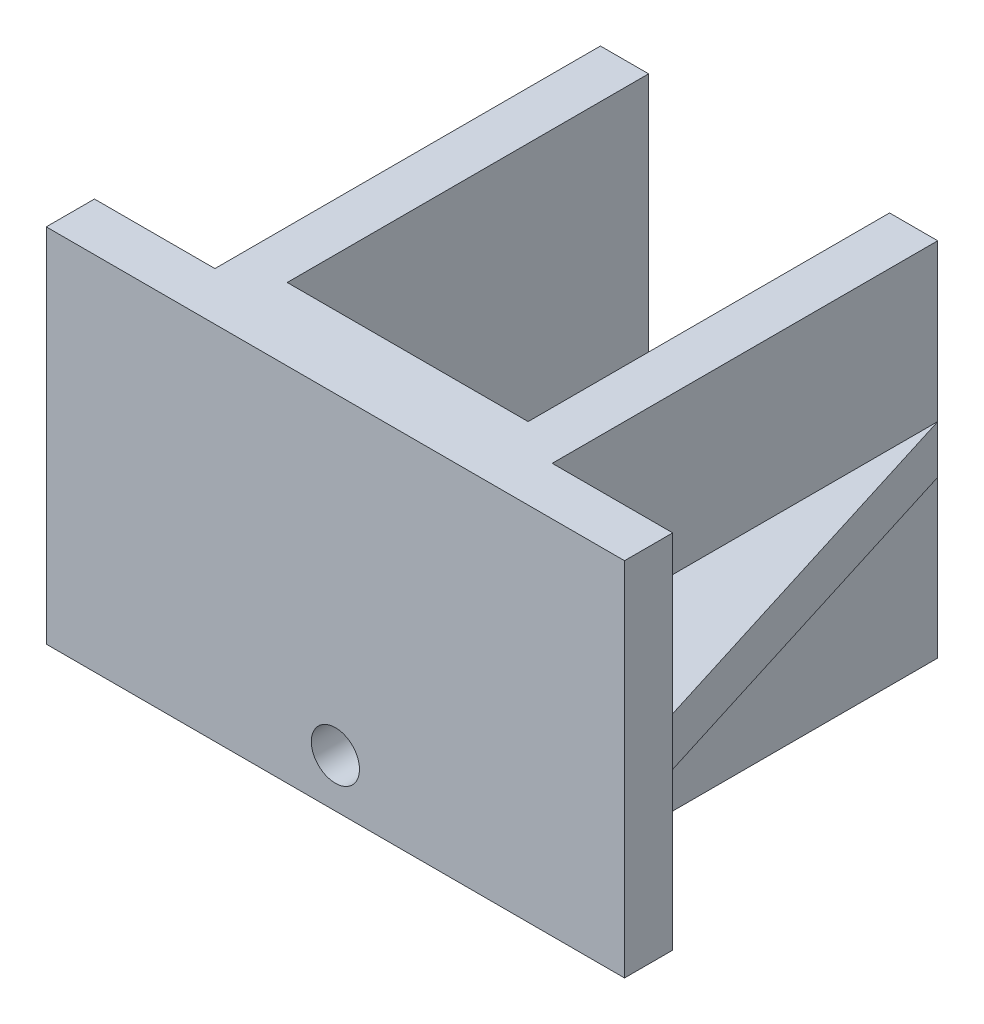
ISO-10303-21;
HEADER;
FILE_DESCRIPTION(('STEP AP214'),'2;1');
FILE_NAME('part.step','',(''),(''),'','','');
FILE_SCHEMA(('AUTOMOTIVE_DESIGN { 1 0 10303 214 1 1 1 1 }'));
ENDSEC;
DATA;
#1=APPLICATION_CONTEXT('core data for automotive mechanical design processes');
#2=APPLICATION_PROTOCOL_DEFINITION('international standard','automotive_design',2000,#1);
#3=PRODUCT_CONTEXT('',#1,'mechanical');
#4=PRODUCT('Part','Part','',(#3));
#5=PRODUCT_RELATED_PRODUCT_CATEGORY('part','',(#4));
#6=PRODUCT_DEFINITION_FORMATION('','',#4);
#7=PRODUCT_DEFINITION_CONTEXT('part definition',#1,'design');
#8=PRODUCT_DEFINITION('design','',#6,#7);
#9=PRODUCT_DEFINITION_SHAPE('','',#8);
#10=(LENGTH_UNIT() NAMED_UNIT(*) SI_UNIT(.MILLI.,.METRE.));
#11=(NAMED_UNIT(*) PLANE_ANGLE_UNIT() SI_UNIT($,.RADIAN.));
#12=(NAMED_UNIT(*) SI_UNIT($,.STERADIAN.) SOLID_ANGLE_UNIT());
#13=UNCERTAINTY_MEASURE_WITH_UNIT(LENGTH_MEASURE(1.E-05),#10,'distance_accuracy_value','');
#14=(GEOMETRIC_REPRESENTATION_CONTEXT(3) GLOBAL_UNCERTAINTY_ASSIGNED_CONTEXT((#13)) GLOBAL_UNIT_ASSIGNED_CONTEXT((#10,
#11,#12)) REPRESENTATION_CONTEXT('',''));
#15=CARTESIAN_POINT('',(0.,0.,0.));
#16=DIRECTION('',(0.,0.,1.));
#17=DIRECTION('',(1.,0.,0.));
#18=AXIS2_PLACEMENT_3D('',#15,#16,#17);
#19=CARTESIAN_POINT('',(-14.,15.,2.));
#20=DIRECTION('',(1.,0.,0.));
#21=DIRECTION('',(0.,0.,-1.));
#22=AXIS2_PLACEMENT_3D('',#19,#20,#21);
#23=PLANE('',#22);
#24=DIRECTION('',(0.,0.,1.));
#25=VECTOR('',#24,1.);
#26=CARTESIAN_POINT('',(-14.,2.,-30.));
#27=LINE('',#26,#25);
#28=CARTESIAN_POINT('',(-14.,2.,-30.));
#29=VERTEX_POINT('',#28);
#30=CARTESIAN_POINT('',(-14.,2.,2.));
#31=VERTEX_POINT('',#30);
#32=EDGE_CURVE('E182',#29,#31,#27,.T.);
#33=ORIENTED_EDGE('',*,*,#32,.T.);
#34=DIRECTION('',(0.,-1.,0.));
#35=VECTOR('',#34,1.);
#36=CARTESIAN_POINT('',(-14.,15.,2.));
#37=LINE('',#36,#35);
#38=CARTESIAN_POINT('',(-14.,15.,2.));
#39=VERTEX_POINT('',#38);
#40=EDGE_CURVE('E195',#39,#31,#37,.T.);
#41=ORIENTED_EDGE('',*,*,#40,.F.);
#42=DIRECTION('',(0.,0.,1.));
#43=VECTOR('',#42,1.);
#44=CARTESIAN_POINT('',(-14.,15.,2.));
#45=LINE('',#44,#43);
#46=CARTESIAN_POINT('',(-14.,15.,-30.));
#47=VERTEX_POINT('',#46);
#48=EDGE_CURVE('E359',#47,#39,#45,.T.);
#49=ORIENTED_EDGE('',*,*,#48,.F.);
#50=DIRECTION('',(0.,-1.,0.));
#51=VECTOR('',#50,1.);
#52=CARTESIAN_POINT('',(-14.,15.,-30.));
#53=LINE('',#52,#51);
#54=EDGE_CURVE('E11',#47,#29,#53,.T.);
#55=ORIENTED_EDGE('',*,*,#54,.T.);
#56=EDGE_LOOP('',(#33,#41,#49,#55));
#57=FACE_BOUND('',#56,.T.);
#58=ADVANCED_FACE('F38',(#57),#23,.F.);
#59=CARTESIAN_POINT('',(-24.,15.,2.));
#60=DIRECTION('',(0.,0.,1.));
#61=DIRECTION('',(1.,0.,0.));
#62=AXIS2_PLACEMENT_3D('',#59,#60,#61);
#63=PLANE('',#62);
#64=DIRECTION('',(-1.,0.,0.));
#65=VECTOR('',#64,1.);
#66=CARTESIAN_POINT('',(-14.,2.,2.));
#67=LINE('',#66,#65);
#68=CARTESIAN_POINT('',(-24.,2.,1.99999999999999));
#69=VERTEX_POINT('',#68);
#70=EDGE_CURVE('E180',#31,#69,#67,.T.);
#71=ORIENTED_EDGE('',*,*,#70,.T.);
#72=DIRECTION('',(0.,-1.,0.));
#73=VECTOR('',#72,1.);
#74=CARTESIAN_POINT('',(-24.,15.,2.));
#75=LINE('',#74,#73);
#76=CARTESIAN_POINT('',(-24.,15.,2.));
#77=VERTEX_POINT('',#76);
#78=EDGE_CURVE('E192',#77,#69,#75,.T.);
#79=ORIENTED_EDGE('',*,*,#78,.F.);
#80=DIRECTION('',(-1.,0.,0.));
#81=VECTOR('',#80,1.);
#82=CARTESIAN_POINT('',(-24.,15.,2.));
#83=LINE('',#82,#81);
#84=EDGE_CURVE('E356',#39,#77,#83,.T.);
#85=ORIENTED_EDGE('',*,*,#84,.F.);
#86=ORIENTED_EDGE('',*,*,#40,.T.);
#87=EDGE_LOOP('',(#71,#79,#85,#86));
#88=FACE_BOUND('',#87,.T.);
#89=ADVANCED_FACE('F190',(#88),#63,.F.);
#90=CARTESIAN_POINT('',(24.,15.,1.99999999999999));
#91=DIRECTION('',(0.,0.,1.));
#92=DIRECTION('',(1.,0.,0.));
#93=AXIS2_PLACEMENT_3D('',#90,#91,#92);
#94=PLANE('',#93);
#95=DIRECTION('',(1.,0.,0.));
#96=VECTOR('',#95,1.);
#97=CARTESIAN_POINT('',(14.,2.,2.));
#98=LINE('',#97,#96);
#99=CARTESIAN_POINT('',(14.,2.,2.));
#100=VERTEX_POINT('',#99);
#101=CARTESIAN_POINT('',(24.,2.,1.99999999999999));
#102=VERTEX_POINT('',#101);
#103=EDGE_CURVE('E370',#100,#102,#98,.T.);
#104=ORIENTED_EDGE('',*,*,#103,.F.);
#105=DIRECTION('',(0.,-1.,0.));
#106=VECTOR('',#105,1.);
#107=CARTESIAN_POINT('',(14.,15.,2.));
#108=LINE('',#107,#106);
#109=CARTESIAN_POINT('',(14.,15.,2.));
#110=VERTEX_POINT('',#109);
#111=EDGE_CURVE('E301',#110,#100,#108,.T.);
#112=ORIENTED_EDGE('',*,*,#111,.F.);
#113=DIRECTION('',(-1.,0.,0.));
#114=VECTOR('',#113,1.);
#115=CARTESIAN_POINT('',(24.,15.,1.99999999999999));
#116=LINE('',#115,#114);
#117=CARTESIAN_POINT('',(24.,15.,1.99999999999999));
#118=VERTEX_POINT('',#117);
#119=EDGE_CURVE('E346',#118,#110,#116,.T.);
#120=ORIENTED_EDGE('',*,*,#119,.F.);
#121=DIRECTION('',(0.,-1.,0.));
#122=VECTOR('',#121,1.);
#123=CARTESIAN_POINT('',(24.,15.,1.99999999999999));
#124=LINE('',#123,#122);
#125=EDGE_CURVE('E306',#118,#102,#124,.T.);
#126=ORIENTED_EDGE('',*,*,#125,.T.);
#127=EDGE_LOOP('',(#104,#112,#120,#126));
#128=FACE_BOUND('',#127,.T.);
#129=ADVANCED_FACE('F443',(#128),#94,.F.);
#130=CARTESIAN_POINT('',(14.,15.,2.));
#131=DIRECTION('',(-1.,0.,0.));
#132=DIRECTION('',(0.,0.,1.));
#133=AXIS2_PLACEMENT_3D('',#130,#131,#132);
#134=PLANE('',#133);
#135=DIRECTION('',(0.,0.,1.));
#136=VECTOR('',#135,1.);
#137=CARTESIAN_POINT('',(14.,2.,-30.));
#138=LINE('',#137,#136);
#139=CARTESIAN_POINT('',(14.,2.,-30.));
#140=VERTEX_POINT('',#139);
#141=EDGE_CURVE('E383',#140,#100,#138,.T.);
#142=ORIENTED_EDGE('',*,*,#141,.F.);
#143=DIRECTION('',(0.,-1.,0.));
#144=VECTOR('',#143,1.);
#145=CARTESIAN_POINT('',(14.,15.,-30.));
#146=LINE('',#145,#144);
#147=CARTESIAN_POINT('',(14.,15.,-30.));
#148=VERTEX_POINT('',#147);
#149=EDGE_CURVE('E296',#148,#140,#146,.T.);
#150=ORIENTED_EDGE('',*,*,#149,.F.);
#151=DIRECTION('',(0.,0.,-1.));
#152=VECTOR('',#151,1.);
#153=CARTESIAN_POINT('',(14.,15.,2.));
#154=LINE('',#153,#152);
#155=EDGE_CURVE('E343',#110,#148,#154,.T.);
#156=ORIENTED_EDGE('',*,*,#155,.F.);
#157=ORIENTED_EDGE('',*,*,#111,.T.);
#158=EDGE_LOOP('',(#142,#150,#156,#157));
#159=FACE_BOUND('',#158,.T.);
#160=ADVANCED_FACE('F449',(#159),#134,.F.);
#161=CARTESIAN_POINT('',(-10.,15.,-30.));
#162=DIRECTION('',(0.,0.,1.));
#163=DIRECTION('',(1.,0.,0.));
#164=AXIS2_PLACEMENT_3D('',#161,#162,#163);
#165=PLANE('',#164);
#166=DIRECTION('',(-1.,0.,0.));
#167=VECTOR('',#166,1.);
#168=CARTESIAN_POINT('',(-10.,-15.,-30.));
#169=LINE('',#168,#167);
#170=CARTESIAN_POINT('',(-10.,-15.,-30.));
#171=VERTEX_POINT('',#170);
#172=CARTESIAN_POINT('',(-14.,-15.,-30.));
#173=VERTEX_POINT('',#172);
#174=EDGE_CURVE('E227',#171,#173,#169,.T.);
#175=ORIENTED_EDGE('',*,*,#174,.T.);
#176=CARTESIAN_POINT('',(-14.,-2.,-30.));
#177=VERTEX_POINT('',#176);
#178=EDGE_CURVE('E47',#177,#173,#53,.T.);
#179=ORIENTED_EDGE('',*,*,#178,.F.);
#180=DIRECTION('',(0.,-1.,0.));
#181=VECTOR('',#180,1.);
#182=CARTESIAN_POINT('',(-14.,2.,-30.));
#183=LINE('',#182,#181);
#184=EDGE_CURVE('E175',#29,#177,#183,.T.);
#185=ORIENTED_EDGE('',*,*,#184,.F.);
#186=ORIENTED_EDGE('',*,*,#54,.F.);
#187=DIRECTION('',(-1.,0.,0.));
#188=VECTOR('',#187,1.);
#189=CARTESIAN_POINT('',(-10.,15.,-30.));
#190=LINE('',#189,#188);
#191=CARTESIAN_POINT('',(-10.,15.,-30.));
#192=VERTEX_POINT('',#191);
#193=EDGE_CURVE('E280',#192,#47,#190,.T.);
#194=ORIENTED_EDGE('',*,*,#193,.F.);
#195=DIRECTION('',(0.,-1.,0.));
#196=VECTOR('',#195,1.);
#197=CARTESIAN_POINT('',(-10.,15.,-30.));
#198=LINE('',#197,#196);
#199=EDGE_CURVE('E236',#192,#171,#198,.T.);
#200=ORIENTED_EDGE('',*,*,#199,.T.);
#201=EDGE_LOOP('',(#175,#179,#185,#186,#194,#200));
#202=FACE_BOUND('',#201,.T.);
#203=ADVANCED_FACE('F40',(#202),#165,.F.);
#204=CARTESIAN_POINT('',(-14.,-2.,2.));
#205=VERTEX_POINT('',#204);
#206=CARTESIAN_POINT('',(-14.,-15.,2.));
#207=VERTEX_POINT('',#206);
#208=EDGE_CURVE('E202',#205,#207,#37,.T.);
#209=ORIENTED_EDGE('',*,*,#208,.F.);
#210=DIRECTION('',(0.,0.,1.));
#211=VECTOR('',#210,1.);
#212=CARTESIAN_POINT('',(-14.,-2.,-30.));
#213=LINE('',#212,#211);
#214=EDGE_CURVE('E185',#177,#205,#213,.T.);
#215=ORIENTED_EDGE('',*,*,#214,.F.);
#216=ORIENTED_EDGE('',*,*,#178,.T.);
#217=DIRECTION('',(0.,0.,1.));
#218=VECTOR('',#217,1.);
#219=CARTESIAN_POINT('',(-14.,-15.,2.));
#220=LINE('',#219,#218);
#221=EDGE_CURVE('E219',#173,#207,#220,.T.);
#222=ORIENTED_EDGE('',*,*,#221,.T.);
#223=EDGE_LOOP('',(#209,#215,#216,#222));
#224=FACE_BOUND('',#223,.T.);
#225=ADVANCED_FACE('F218',(#224),#23,.F.);
#226=CARTESIAN_POINT('',(-24.,-2.,2.));
#227=VERTEX_POINT('',#226);
#228=CARTESIAN_POINT('',(-24.,-15.,2.));
#229=VERTEX_POINT('',#228);
#230=EDGE_CURVE('E203',#227,#229,#75,.T.);
#231=ORIENTED_EDGE('',*,*,#230,.F.);
#232=DIRECTION('',(-1.,0.,0.));
#233=VECTOR('',#232,1.);
#234=CARTESIAN_POINT('',(-14.,-2.,2.));
#235=LINE('',#234,#233);
#236=EDGE_CURVE('E54',#205,#227,#235,.T.);
#237=ORIENTED_EDGE('',*,*,#236,.F.);
#238=ORIENTED_EDGE('',*,*,#208,.T.);
#239=DIRECTION('',(-1.,0.,0.));
#240=VECTOR('',#239,1.);
#241=CARTESIAN_POINT('',(-24.,-15.,2.));
#242=LINE('',#241,#240);
#243=EDGE_CURVE('E230',#207,#229,#242,.T.);
#244=ORIENTED_EDGE('',*,*,#243,.T.);
#245=EDGE_LOOP('',(#231,#237,#238,#244));
#246=FACE_BOUND('',#245,.T.);
#247=ADVANCED_FACE('F459',(#246),#63,.F.);
#248=CARTESIAN_POINT('',(-24.,15.,6.));
#249=DIRECTION('',(1.,0.,0.));
#250=DIRECTION('',(0.,0.,-1.));
#251=AXIS2_PLACEMENT_3D('',#248,#249,#250);
#252=PLANE('',#251);
#253=DIRECTION('',(0.,0.,1.));
#254=VECTOR('',#253,1.);
#255=CARTESIAN_POINT('',(-24.,-15.,6.));
#256=LINE('',#255,#254);
#257=CARTESIAN_POINT('',(-24.,-15.,6.));
#258=VERTEX_POINT('',#257);
#259=EDGE_CURVE('E250',#229,#258,#256,.T.);
#260=ORIENTED_EDGE('',*,*,#259,.T.);
#261=DIRECTION('',(0.,-1.,0.));
#262=VECTOR('',#261,1.);
#263=CARTESIAN_POINT('',(-24.,15.,6.));
#264=LINE('',#263,#262);
#265=CARTESIAN_POINT('',(-24.,15.,6.));
#266=VERTEX_POINT('',#265);
#267=EDGE_CURVE('E207',#266,#258,#264,.T.);
#268=ORIENTED_EDGE('',*,*,#267,.F.);
#269=DIRECTION('',(0.,0.,1.));
#270=VECTOR('',#269,1.);
#271=CARTESIAN_POINT('',(-24.,15.,6.));
#272=LINE('',#271,#270);
#273=EDGE_CURVE('E200',#77,#266,#272,.T.);
#274=ORIENTED_EDGE('',*,*,#273,.F.);
#275=ORIENTED_EDGE('',*,*,#78,.T.);
#276=DIRECTION('',(0.,-1.,0.));
#277=VECTOR('',#276,1.);
#278=CARTESIAN_POINT('',(-24.,2.,1.99999999999999));
#279=LINE('',#278,#277);
#280=EDGE_CURVE('E165',#69,#227,#279,.T.);
#281=ORIENTED_EDGE('',*,*,#280,.T.);
#282=ORIENTED_EDGE('',*,*,#230,.T.);
#283=EDGE_LOOP('',(#260,#268,#274,#275,#281,#282));
#284=FACE_BOUND('',#283,.T.);
#285=ADVANCED_FACE('F198',(#284),#252,.F.);
#286=CARTESIAN_POINT('',(-24.,15.,6.));
#287=DIRECTION('',(0.,0.,-1.));
#288=DIRECTION('',(-1.,0.,0.));
#289=AXIS2_PLACEMENT_3D('',#286,#287,#288);
#290=PLANE('',#289);
#291=CARTESIAN_POINT('',(0.,-11.,6.));
#292=DIRECTION('',(0.,0.,-1.));
#293=DIRECTION('',(-1.,0.,0.));
#294=AXIS2_PLACEMENT_3D('',#291,#292,#293);
#295=CIRCLE('',#294,2.);
#296=CARTESIAN_POINT('',(-2.,-11.,6.));
#297=VERTEX_POINT('',#296);
#298=EDGE_CURVE('E396',#297,#297,#295,.T.);
#299=ORIENTED_EDGE('',*,*,#298,.T.);
#300=EDGE_LOOP('',(#299));
#301=FACE_BOUND('',#300,.T.);
#302=DIRECTION('',(1.,0.,0.));
#303=VECTOR('',#302,1.);
#304=CARTESIAN_POINT('',(-24.,-15.,6.));
#305=LINE('',#304,#303);
#306=CARTESIAN_POINT('',(24.,-15.,5.99999999999999));
#307=VERTEX_POINT('',#306);
#308=EDGE_CURVE('E253',#258,#307,#305,.T.);
#309=ORIENTED_EDGE('',*,*,#308,.T.);
#310=DIRECTION('',(0.,-1.,0.));
#311=VECTOR('',#310,1.);
#312=CARTESIAN_POINT('',(24.,15.,5.99999999999999));
#313=LINE('',#312,#311);
#314=CARTESIAN_POINT('',(24.,15.,5.99999999999999));
#315=VERTEX_POINT('',#314);
#316=EDGE_CURVE('E309',#315,#307,#313,.T.);
#317=ORIENTED_EDGE('',*,*,#316,.F.);
#318=DIRECTION('',(1.,0.,0.));
#319=VECTOR('',#318,1.);
#320=CARTESIAN_POINT('',(-24.,15.,6.));
#321=LINE('',#320,#319);
#322=EDGE_CURVE('E322',#266,#315,#321,.T.);
#323=ORIENTED_EDGE('',*,*,#322,.F.);
#324=ORIENTED_EDGE('',*,*,#267,.T.);
#325=EDGE_LOOP('',(#309,#317,#323,#324));
#326=FACE_BOUND('',#325,.T.);
#327=ADVANCED_FACE('F321',(#301,#326),#290,.F.);
#328=CARTESIAN_POINT('',(24.,15.,5.99999999999999));
#329=DIRECTION('',(-1.,0.,0.));
#330=DIRECTION('',(0.,0.,1.));
#331=AXIS2_PLACEMENT_3D('',#328,#329,#330);
#332=PLANE('',#331);
#333=DIRECTION('',(0.,0.,-1.));
#334=VECTOR('',#333,1.);
#335=CARTESIAN_POINT('',(24.,-15.,5.99999999999999));
#336=LINE('',#335,#334);
#337=CARTESIAN_POINT('',(24.,-15.,1.99999999999999));
#338=VERTEX_POINT('',#337);
#339=EDGE_CURVE('E256',#307,#338,#336,.T.);
#340=ORIENTED_EDGE('',*,*,#339,.T.);
#341=CARTESIAN_POINT('',(24.,-2.,1.99999999999999));
#342=VERTEX_POINT('',#341);
#343=EDGE_CURVE('E305',#342,#338,#124,.T.);
#344=ORIENTED_EDGE('',*,*,#343,.F.);
#345=DIRECTION('',(0.,-1.,0.));
#346=VECTOR('',#345,1.);
#347=CARTESIAN_POINT('',(24.,2.,1.99999999999999));
#348=LINE('',#347,#346);
#349=EDGE_CURVE('E242',#102,#342,#348,.T.);
#350=ORIENTED_EDGE('',*,*,#349,.F.);
#351=ORIENTED_EDGE('',*,*,#125,.F.);
#352=DIRECTION('',(0.,0.,-1.));
#353=VECTOR('',#352,1.);
#354=CARTESIAN_POINT('',(24.,15.,5.99999999999999));
#355=LINE('',#354,#353);
#356=EDGE_CURVE('E349',#315,#118,#355,.T.);
#357=ORIENTED_EDGE('',*,*,#356,.F.);
#358=ORIENTED_EDGE('',*,*,#316,.T.);
#359=EDGE_LOOP('',(#340,#344,#350,#351,#357,#358));
#360=FACE_BOUND('',#359,.T.);
#361=ADVANCED_FACE('F326',(#360),#332,.F.);
#362=CARTESIAN_POINT('',(14.,-2.,2.));
#363=VERTEX_POINT('',#362);
#364=CARTESIAN_POINT('',(14.,-15.,2.));
#365=VERTEX_POINT('',#364);
#366=EDGE_CURVE('E300',#363,#365,#108,.T.);
#367=ORIENTED_EDGE('',*,*,#366,.F.);
#368=DIRECTION('',(1.,0.,0.));
#369=VECTOR('',#368,1.);
#370=CARTESIAN_POINT('',(14.,-2.,2.));
#371=LINE('',#370,#369);
#372=EDGE_CURVE('E371',#363,#342,#371,.T.);
#373=ORIENTED_EDGE('',*,*,#372,.T.);
#374=ORIENTED_EDGE('',*,*,#343,.T.);
#375=DIRECTION('',(-1.,0.,0.));
#376=VECTOR('',#375,1.);
#377=CARTESIAN_POINT('',(24.,-15.,1.99999999999999));
#378=LINE('',#377,#376);
#379=EDGE_CURVE('E260',#338,#365,#378,.T.);
#380=ORIENTED_EDGE('',*,*,#379,.T.);
#381=EDGE_LOOP('',(#367,#373,#374,#380));
#382=FACE_BOUND('',#381,.T.);
#383=ADVANCED_FACE('F440',(#382),#94,.F.);
#384=CARTESIAN_POINT('',(14.,-2.,-30.));
#385=VERTEX_POINT('',#384);
#386=CARTESIAN_POINT('',(14.,-15.,-30.));
#387=VERTEX_POINT('',#386);
#388=EDGE_CURVE('E295',#385,#387,#146,.T.);
#389=ORIENTED_EDGE('',*,*,#388,.F.);
#390=DIRECTION('',(0.,0.,1.));
#391=VECTOR('',#390,1.);
#392=CARTESIAN_POINT('',(14.,-2.,-30.));
#393=LINE('',#392,#391);
#394=EDGE_CURVE('E375',#385,#363,#393,.T.);
#395=ORIENTED_EDGE('',*,*,#394,.T.);
#396=ORIENTED_EDGE('',*,*,#366,.T.);
#397=DIRECTION('',(0.,0.,-1.));
#398=VECTOR('',#397,1.);
#399=CARTESIAN_POINT('',(14.,-15.,2.));
#400=LINE('',#399,#398);
#401=EDGE_CURVE('E264',#365,#387,#400,.T.);
#402=ORIENTED_EDGE('',*,*,#401,.T.);
#403=EDGE_LOOP('',(#389,#395,#396,#402));
#404=FACE_BOUND('',#403,.T.);
#405=ADVANCED_FACE('F438',(#404),#134,.F.);
#406=CARTESIAN_POINT('',(9.99999999999999,15.,-30.));
#407=DIRECTION('',(0.,0.,1.));
#408=DIRECTION('',(1.,0.,0.));
#409=AXIS2_PLACEMENT_3D('',#406,#407,#408);
#410=PLANE('',#409);
#411=DIRECTION('',(-1.,0.,0.));
#412=VECTOR('',#411,1.);
#413=CARTESIAN_POINT('',(9.99999999999999,-15.,-30.));
#414=LINE('',#413,#412);
#415=CARTESIAN_POINT('',(9.99999999999999,-15.,-30.));
#416=VERTEX_POINT('',#415);
#417=EDGE_CURVE('E268',#387,#416,#414,.T.);
#418=ORIENTED_EDGE('',*,*,#417,.T.);
#419=DIRECTION('',(0.,-1.,0.));
#420=VECTOR('',#419,1.);
#421=CARTESIAN_POINT('',(9.99999999999999,15.,-30.));
#422=LINE('',#421,#420);
#423=CARTESIAN_POINT('',(9.99999999999999,15.,-30.));
#424=VERTEX_POINT('',#423);
#425=EDGE_CURVE('E291',#424,#416,#422,.T.);
#426=ORIENTED_EDGE('',*,*,#425,.F.);
#427=DIRECTION('',(-1.,0.,0.));
#428=VECTOR('',#427,1.);
#429=CARTESIAN_POINT('',(9.99999999999999,15.,-30.));
#430=LINE('',#429,#428);
#431=EDGE_CURVE('E340',#148,#424,#430,.T.);
#432=ORIENTED_EDGE('',*,*,#431,.F.);
#433=ORIENTED_EDGE('',*,*,#149,.T.);
#434=DIRECTION('',(0.,-1.,0.));
#435=VECTOR('',#434,1.);
#436=CARTESIAN_POINT('',(14.,2.,-30.));
#437=LINE('',#436,#435);
#438=EDGE_CURVE('E238',#140,#385,#437,.T.);
#439=ORIENTED_EDGE('',*,*,#438,.T.);
#440=ORIENTED_EDGE('',*,*,#388,.T.);
#441=EDGE_LOOP('',(#418,#426,#432,#433,#439,#440));
#442=FACE_BOUND('',#441,.T.);
#443=ADVANCED_FACE('F435',(#442),#410,.F.);
#444=CARTESIAN_POINT('',(10.,15.,0.));
#445=DIRECTION('',(1.,0.,0.));
#446=DIRECTION('',(0.,0.,-1.));
#447=AXIS2_PLACEMENT_3D('',#444,#445,#446);
#448=PLANE('',#447);
#449=DIRECTION('',(0.,0.,1.));
#450=VECTOR('',#449,1.);
#451=CARTESIAN_POINT('',(10.,-15.,0.));
#452=LINE('',#451,#450);
#453=CARTESIAN_POINT('',(10.,-15.,0.));
#454=VERTEX_POINT('',#453);
#455=EDGE_CURVE('E271',#416,#454,#452,.T.);
#456=ORIENTED_EDGE('',*,*,#455,.T.);
#457=DIRECTION('',(0.,-1.,0.));
#458=VECTOR('',#457,1.);
#459=CARTESIAN_POINT('',(10.,15.,0.));
#460=LINE('',#459,#458);
#461=CARTESIAN_POINT('',(10.,15.,0.));
#462=VERTEX_POINT('',#461);
#463=EDGE_CURVE('E287',#462,#454,#460,.T.);
#464=ORIENTED_EDGE('',*,*,#463,.F.);
#465=DIRECTION('',(0.,0.,1.));
#466=VECTOR('',#465,1.);
#467=CARTESIAN_POINT('',(10.,15.,0.));
#468=LINE('',#467,#466);
#469=EDGE_CURVE('E338',#424,#462,#468,.T.);
#470=ORIENTED_EDGE('',*,*,#469,.F.);
#471=ORIENTED_EDGE('',*,*,#425,.T.);
#472=EDGE_LOOP('',(#456,#464,#470,#471));
#473=FACE_BOUND('',#472,.T.);
#474=ADVANCED_FACE('F419',(#473),#448,.F.);
#475=CARTESIAN_POINT('',(10.,15.,0.));
#476=DIRECTION('',(0.,0.,1.));
#477=DIRECTION('',(1.,0.,0.));
#478=AXIS2_PLACEMENT_3D('',#475,#476,#477);
#479=PLANE('',#478);
#480=CARTESIAN_POINT('',(0.,-11.,0.));
#481=DIRECTION('',(0.,0.,-1.));
#482=DIRECTION('',(-1.,0.,0.));
#483=AXIS2_PLACEMENT_3D('',#480,#481,#482);
#484=CIRCLE('',#483,2.);
#485=CARTESIAN_POINT('',(-2.,-11.,0.));
#486=VERTEX_POINT('',#485);
#487=EDGE_CURVE('E399',#486,#486,#484,.T.);
#488=ORIENTED_EDGE('',*,*,#487,.F.);
#489=EDGE_LOOP('',(#488));
#490=FACE_BOUND('',#489,.T.);
#491=DIRECTION('',(-1.,0.,0.));
#492=VECTOR('',#491,1.);
#493=CARTESIAN_POINT('',(10.,-15.,0.));
#494=LINE('',#493,#492);
#495=CARTESIAN_POINT('',(-10.,-15.,0.));
#496=VERTEX_POINT('',#495);
#497=EDGE_CURVE('E274',#454,#496,#494,.T.);
#498=ORIENTED_EDGE('',*,*,#497,.T.);
#499=DIRECTION('',(0.,-1.,0.));
#500=VECTOR('',#499,1.);
#501=CARTESIAN_POINT('',(-10.,15.,0.));
#502=LINE('',#501,#500);
#503=CARTESIAN_POINT('',(-10.,15.,0.));
#504=VERTEX_POINT('',#503);
#505=EDGE_CURVE('E283',#504,#496,#502,.T.);
#506=ORIENTED_EDGE('',*,*,#505,.F.);
#507=DIRECTION('',(-1.,0.,0.));
#508=VECTOR('',#507,1.);
#509=CARTESIAN_POINT('',(10.,15.,0.));
#510=LINE('',#509,#508);
#511=EDGE_CURVE('E336',#462,#504,#510,.T.);
#512=ORIENTED_EDGE('',*,*,#511,.F.);
#513=ORIENTED_EDGE('',*,*,#463,.T.);
#514=EDGE_LOOP('',(#498,#506,#512,#513));
#515=FACE_BOUND('',#514,.T.);
#516=ADVANCED_FACE('F415',(#490,#515),#479,.F.);
#517=CARTESIAN_POINT('',(-10.,15.,0.));
#518=DIRECTION('',(-1.,0.,0.));
#519=DIRECTION('',(0.,0.,1.));
#520=AXIS2_PLACEMENT_3D('',#517,#518,#519);
#521=PLANE('',#520);
#522=DIRECTION('',(0.,0.,-1.));
#523=VECTOR('',#522,1.);
#524=CARTESIAN_POINT('',(-10.,-15.,0.));
#525=LINE('',#524,#523);
#526=EDGE_CURVE('E277',#496,#171,#525,.T.);
#527=ORIENTED_EDGE('',*,*,#526,.T.);
#528=ORIENTED_EDGE('',*,*,#199,.F.);
#529=DIRECTION('',(0.,0.,-1.));
#530=VECTOR('',#529,1.);
#531=CARTESIAN_POINT('',(-10.,15.,0.));
#532=LINE('',#531,#530);
#533=EDGE_CURVE('E245',#504,#192,#532,.T.);
#534=ORIENTED_EDGE('',*,*,#533,.F.);
#535=ORIENTED_EDGE('',*,*,#505,.T.);
#536=EDGE_LOOP('',(#527,#528,#534,#535));
#537=FACE_BOUND('',#536,.T.);
#538=ADVANCED_FACE('F418',(#537),#521,.F.);
#539=CARTESIAN_POINT('',(0.,15.,0.));
#540=DIRECTION('',(0.,-1.,0.));
#541=DIRECTION('',(0.,0.,-1.));
#542=AXIS2_PLACEMENT_3D('',#539,#540,#541);
#543=PLANE('',#542);
#544=ORIENTED_EDGE('',*,*,#193,.T.);
#545=ORIENTED_EDGE('',*,*,#48,.T.);
#546=ORIENTED_EDGE('',*,*,#84,.T.);
#547=ORIENTED_EDGE('',*,*,#273,.T.);
#548=ORIENTED_EDGE('',*,*,#322,.T.);
#549=ORIENTED_EDGE('',*,*,#356,.T.);
#550=ORIENTED_EDGE('',*,*,#119,.T.);
#551=ORIENTED_EDGE('',*,*,#155,.T.);
#552=ORIENTED_EDGE('',*,*,#431,.T.);
#553=ORIENTED_EDGE('',*,*,#469,.T.);
#554=ORIENTED_EDGE('',*,*,#511,.T.);
#555=ORIENTED_EDGE('',*,*,#533,.T.);
#556=EDGE_LOOP('',(#544,#545,#546,#547,#548,#549,#550,#551,#552,#553,#554,#555));
#557=FACE_BOUND('',#556,.T.);
#558=ADVANCED_FACE('F428',(#557),#543,.F.);
#559=CARTESIAN_POINT('',(0.,-15.,0.));
#560=DIRECTION('',(0.,-1.,0.));
#561=DIRECTION('',(0.,0.,-1.));
#562=AXIS2_PLACEMENT_3D('',#559,#560,#561);
#563=PLANE('',#562);
#564=ORIENTED_EDGE('',*,*,#174,.F.);
#565=ORIENTED_EDGE('',*,*,#526,.F.);
#566=ORIENTED_EDGE('',*,*,#497,.F.);
#567=ORIENTED_EDGE('',*,*,#455,.F.);
#568=ORIENTED_EDGE('',*,*,#417,.F.);
#569=ORIENTED_EDGE('',*,*,#401,.F.);
#570=ORIENTED_EDGE('',*,*,#379,.F.);
#571=ORIENTED_EDGE('',*,*,#339,.F.);
#572=ORIENTED_EDGE('',*,*,#308,.F.);
#573=ORIENTED_EDGE('',*,*,#259,.F.);
#574=ORIENTED_EDGE('',*,*,#243,.F.);
#575=ORIENTED_EDGE('',*,*,#221,.F.);
#576=EDGE_LOOP('',(#564,#565,#566,#567,#568,#569,#570,#571,#572,#573,#574,#575));
#577=FACE_BOUND('',#576,.T.);
#578=ADVANCED_FACE('F225',(#577),#563,.T.);
#579=CARTESIAN_POINT('',(24.,2.,1.99999999999999));
#580=DIRECTION('',(-0.95447997803503,0.,0.298274993135947));
#581=DIRECTION('',(0.298274993135947,0.,0.95447997803503));
#582=AXIS2_PLACEMENT_3D('',#579,#580,#581);
#583=PLANE('',#582);
#584=DIRECTION('',(-0.298274993135947,0.,-0.95447997803503));
#585=VECTOR('',#584,1.);
#586=CARTESIAN_POINT('',(24.,-2.,1.99999999999999));
#587=LINE('',#586,#585);
#588=EDGE_CURVE('E62',#342,#385,#587,.T.);
#589=ORIENTED_EDGE('',*,*,#588,.T.);
#590=ORIENTED_EDGE('',*,*,#438,.F.);
#591=DIRECTION('',(-0.298274993135947,0.,-0.95447997803503));
#592=VECTOR('',#591,1.);
#593=CARTESIAN_POINT('',(24.,2.,1.99999999999999));
#594=LINE('',#593,#592);
#595=EDGE_CURVE('E374',#102,#140,#594,.T.);
#596=ORIENTED_EDGE('',*,*,#595,.F.);
#597=ORIENTED_EDGE('',*,*,#349,.T.);
#598=EDGE_LOOP('',(#589,#590,#596,#597));
#599=FACE_BOUND('',#598,.T.);
#600=ADVANCED_FACE('F482',(#599),#583,.F.);
#601=CARTESIAN_POINT('',(0.,2.,0.));
#602=DIRECTION('',(0.,-1.,0.));
#603=DIRECTION('',(0.,0.,-1.));
#604=AXIS2_PLACEMENT_3D('',#601,#602,#603);
#605=PLANE('',#604);
#606=ORIENTED_EDGE('',*,*,#595,.T.);
#607=ORIENTED_EDGE('',*,*,#141,.T.);
#608=ORIENTED_EDGE('',*,*,#103,.T.);
#609=EDGE_LOOP('',(#606,#607,#608));
#610=FACE_BOUND('',#609,.T.);
#611=ADVANCED_FACE('F487',(#610),#605,.F.);
#612=CARTESIAN_POINT('',(0.,-2.,0.));
#613=DIRECTION('',(0.,-1.,0.));
#614=DIRECTION('',(0.,0.,-1.));
#615=AXIS2_PLACEMENT_3D('',#612,#613,#614);
#616=PLANE('',#615);
#617=ORIENTED_EDGE('',*,*,#588,.F.);
#618=ORIENTED_EDGE('',*,*,#372,.F.);
#619=ORIENTED_EDGE('',*,*,#394,.F.);
#620=EDGE_LOOP('',(#617,#618,#619));
#621=FACE_BOUND('',#620,.T.);
#622=ADVANCED_FACE('F488',(#621),#616,.T.);
#623=CARTESIAN_POINT('',(-24.,2.,1.99999999999999));
#624=DIRECTION('',(-0.95447997803503,0.,-0.298274993135947));
#625=DIRECTION('',(-0.298274993135947,0.,0.95447997803503));
#626=AXIS2_PLACEMENT_3D('',#623,#624,#625);
#627=PLANE('',#626);
#628=DIRECTION('',(0.298274993135947,0.,-0.95447997803503));
#629=VECTOR('',#628,1.);
#630=CARTESIAN_POINT('',(-24.,-2.,1.99999999999999));
#631=LINE('',#630,#629);
#632=EDGE_CURVE('E170',#227,#177,#631,.T.);
#633=ORIENTED_EDGE('',*,*,#632,.F.);
#634=ORIENTED_EDGE('',*,*,#280,.F.);
#635=DIRECTION('',(0.298274993135947,0.,-0.95447997803503));
#636=VECTOR('',#635,1.);
#637=CARTESIAN_POINT('',(-24.,2.,1.99999999999999));
#638=LINE('',#637,#636);
#639=EDGE_CURVE('E168',#69,#29,#638,.T.);
#640=ORIENTED_EDGE('',*,*,#639,.T.);
#641=ORIENTED_EDGE('',*,*,#184,.T.);
#642=EDGE_LOOP('',(#633,#634,#640,#641));
#643=FACE_BOUND('',#642,.T.);
#644=ADVANCED_FACE('F167',(#643),#627,.T.);
#645=CARTESIAN_POINT('',(0.,2.,0.));
#646=DIRECTION('',(0.,-1.,0.));
#647=DIRECTION('',(0.,0.,-1.));
#648=AXIS2_PLACEMENT_3D('',#645,#646,#647);
#649=PLANE('',#648);
#650=ORIENTED_EDGE('',*,*,#639,.F.);
#651=ORIENTED_EDGE('',*,*,#70,.F.);
#652=ORIENTED_EDGE('',*,*,#32,.F.);
#653=EDGE_LOOP('',(#650,#651,#652));
#654=FACE_BOUND('',#653,.T.);
#655=ADVANCED_FACE('F179',(#654),#649,.F.);
#656=CARTESIAN_POINT('',(0.,-2.,0.));
#657=DIRECTION('',(0.,-1.,0.));
#658=DIRECTION('',(0.,0.,-1.));
#659=AXIS2_PLACEMENT_3D('',#656,#657,#658);
#660=PLANE('',#659);
#661=ORIENTED_EDGE('',*,*,#632,.T.);
#662=ORIENTED_EDGE('',*,*,#214,.T.);
#663=ORIENTED_EDGE('',*,*,#236,.T.);
#664=EDGE_LOOP('',(#661,#662,#663));
#665=FACE_BOUND('',#664,.T.);
#666=ADVANCED_FACE('F411',(#665),#660,.T.);
#667=CARTESIAN_POINT('',(0.,-11.,6.));
#668=DIRECTION('',(0.,0.,-1.));
#669=DIRECTION('',(-1.,0.,0.));
#670=AXIS2_PLACEMENT_3D('',#667,#668,#669);
#671=CYLINDRICAL_SURFACE('',#670,2.);
#672=ORIENTED_EDGE('',*,*,#298,.F.);
#673=EDGE_LOOP('',(#672));
#674=FACE_BOUND('',#673,.T.);
#675=ORIENTED_EDGE('',*,*,#487,.T.);
#676=EDGE_LOOP('',(#675));
#677=FACE_BOUND('',#676,.T.);
#678=ADVANCED_FACE('F408',(#674,#677),#671,.F.);
#679=CLOSED_SHELL('',(#58,#89,#129,#160,#203,#225,#247,#285,#327,#361,#383,#405,#443,#474,#516,
#538,#558,#578,#600,#611,#622,#644,#655,#666,#678));
#680=MANIFOLD_SOLID_BREP('B2',#679);
#681=ADVANCED_BREP_SHAPE_REPRESENTATION('',(#18,#680),#14);
#682=SHAPE_DEFINITION_REPRESENTATION(#9,#681);
ENDSEC;
END-ISO-10303-21;
